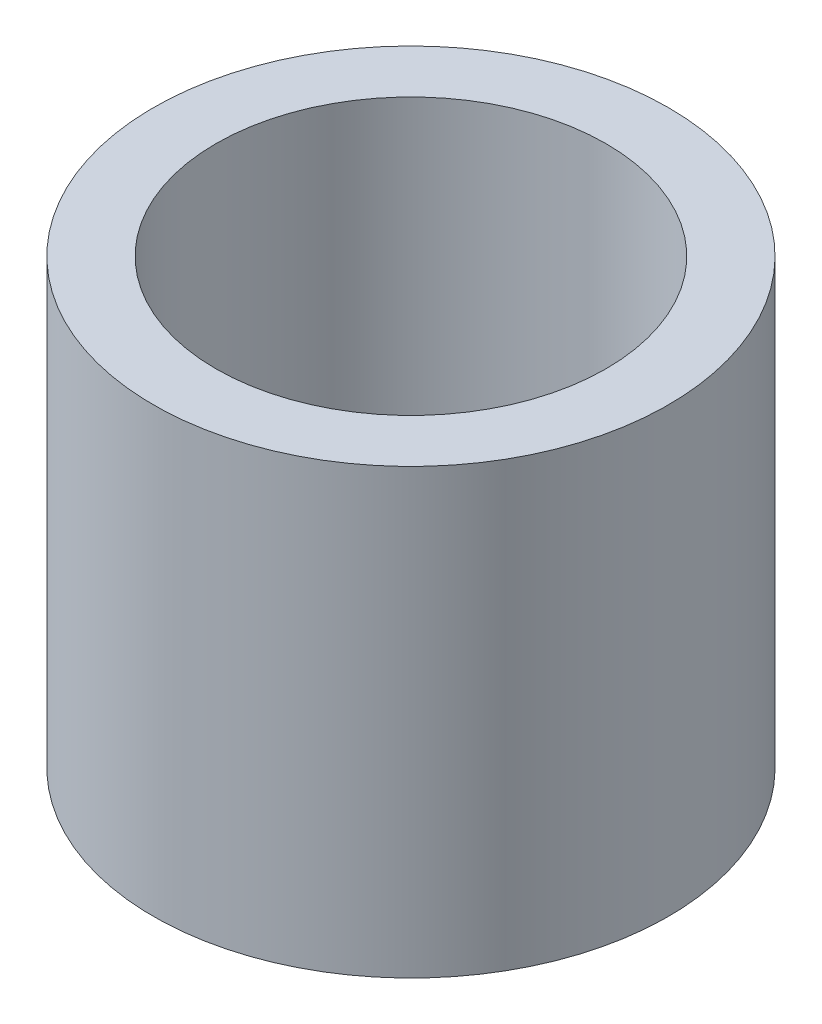
ISO-10303-21;
HEADER;
FILE_DESCRIPTION(('STEP AP214'),'2;1');
FILE_NAME('part.step','',(''),(''),'','','');
FILE_SCHEMA(('AUTOMOTIVE_DESIGN { 1 0 10303 214 1 1 1 1 }'));
ENDSEC;
DATA;
#1=APPLICATION_CONTEXT('core data for automotive mechanical design processes');
#2=APPLICATION_PROTOCOL_DEFINITION('international standard','automotive_design',2000,#1);
#3=PRODUCT_CONTEXT('',#1,'mechanical');
#4=PRODUCT('Part','Part','',(#3));
#5=PRODUCT_RELATED_PRODUCT_CATEGORY('part','',(#4));
#6=PRODUCT_DEFINITION_FORMATION('','',#4);
#7=PRODUCT_DEFINITION_CONTEXT('part definition',#1,'design');
#8=PRODUCT_DEFINITION('design','',#6,#7);
#9=PRODUCT_DEFINITION_SHAPE('','',#8);
#10=(LENGTH_UNIT() NAMED_UNIT(*) SI_UNIT(.MILLI.,.METRE.));
#11=(NAMED_UNIT(*) PLANE_ANGLE_UNIT() SI_UNIT($,.RADIAN.));
#12=(NAMED_UNIT(*) SI_UNIT($,.STERADIAN.) SOLID_ANGLE_UNIT());
#13=UNCERTAINTY_MEASURE_WITH_UNIT(LENGTH_MEASURE(1.E-05),#10,'distance_accuracy_value','');
#14=(GEOMETRIC_REPRESENTATION_CONTEXT(3) GLOBAL_UNCERTAINTY_ASSIGNED_CONTEXT((#13)) GLOBAL_UNIT_ASSIGNED_CONTEXT((#10,
#11,#12)) REPRESENTATION_CONTEXT('',''));
#15=CARTESIAN_POINT('',(0.,0.,0.));
#16=DIRECTION('',(0.,0.,1.));
#17=DIRECTION('',(1.,0.,0.));
#18=AXIS2_PLACEMENT_3D('',#15,#16,#17);
#19=CARTESIAN_POINT('',(-8.25,0.,0.));
#20=DIRECTION('',(0.,1.,0.));
#21=DIRECTION('',(0.,0.,1.));
#22=AXIS2_PLACEMENT_3D('',#19,#20,#21);
#23=PLANE('',#22);
#24=CARTESIAN_POINT('',(0.,0.,0.));
#25=DIRECTION('',(0.,-1.,0.));
#26=DIRECTION('',(0.,0.,-1.));
#27=AXIS2_PLACEMENT_3D('',#24,#25,#26);
#28=CIRCLE('',#27,2.5);
#29=CARTESIAN_POINT('',(0.,0.,-2.5));
#30=VERTEX_POINT('',#29);
#31=EDGE_CURVE('E10',#30,#30,#28,.T.);
#32=ORIENTED_EDGE('',*,*,#31,.F.);
#33=EDGE_LOOP('',(#32));
#34=FACE_BOUND('',#33,.T.);
#35=CARTESIAN_POINT('',(0.,0.,0.));
#36=DIRECTION('',(0.,-1.,0.));
#37=DIRECTION('',(0.,0.,-1.));
#38=AXIS2_PLACEMENT_3D('',#35,#36,#37);
#39=CIRCLE('',#38,8.25);
#40=CARTESIAN_POINT('',(0.,0.,-8.25));
#41=VERTEX_POINT('',#40);
#42=EDGE_CURVE('E53',#41,#41,#39,.T.);
#43=ORIENTED_EDGE('',*,*,#42,.T.);
#44=EDGE_LOOP('',(#43));
#45=FACE_BOUND('',#44,.T.);
#46=ADVANCED_FACE('F31',(#34,#45),#23,.F.);
#47=CARTESIAN_POINT('',(0.,0.,0.));
#48=DIRECTION('',(0.,-1.,0.));
#49=DIRECTION('',(0.,0.,-1.));
#50=AXIS2_PLACEMENT_3D('',#47,#48,#49);
#51=CYLINDRICAL_SURFACE('',#50,2.5);
#52=CARTESIAN_POINT('',(0.,2.,0.));
#53=DIRECTION('',(0.,-1.,0.));
#54=DIRECTION('',(0.,0.,-1.));
#55=AXIS2_PLACEMENT_3D('',#52,#53,#54);
#56=CIRCLE('',#55,2.5);
#57=CARTESIAN_POINT('',(0.,2.,-2.5));
#58=VERTEX_POINT('',#57);
#59=EDGE_CURVE('E37',#58,#58,#56,.T.);
#60=ORIENTED_EDGE('',*,*,#59,.F.);
#61=EDGE_LOOP('',(#60));
#62=FACE_BOUND('',#61,.T.);
#63=ORIENTED_EDGE('',*,*,#31,.T.);
#64=EDGE_LOOP('',(#63));
#65=FACE_BOUND('',#64,.T.);
#66=ADVANCED_FACE('F78',(#62,#65),#51,.F.);
#67=CARTESIAN_POINT('',(-2.5,2.,0.));
#68=DIRECTION('',(0.,-1.,0.));
#69=DIRECTION('',(0.,0.,-1.));
#70=AXIS2_PLACEMENT_3D('',#67,#68,#69);
#71=PLANE('',#70);
#72=CARTESIAN_POINT('',(0.,2.,0.));
#73=DIRECTION('',(0.,-1.,0.));
#74=DIRECTION('',(0.,0.,-1.));
#75=AXIS2_PLACEMENT_3D('',#72,#73,#74);
#76=CIRCLE('',#75,6.25);
#77=CARTESIAN_POINT('',(0.,2.,-6.25));
#78=VERTEX_POINT('',#77);
#79=EDGE_CURVE('E41',#78,#78,#76,.T.);
#80=ORIENTED_EDGE('',*,*,#79,.F.);
#81=EDGE_LOOP('',(#80));
#82=FACE_BOUND('',#81,.T.);
#83=ORIENTED_EDGE('',*,*,#59,.T.);
#84=EDGE_LOOP('',(#83));
#85=FACE_BOUND('',#84,.T.);
#86=ADVANCED_FACE('F73',(#82,#85),#71,.F.);
#87=CARTESIAN_POINT('',(0.,0.,0.));
#88=DIRECTION('',(0.,-1.,0.));
#89=DIRECTION('',(0.,0.,-1.));
#90=AXIS2_PLACEMENT_3D('',#87,#88,#89);
#91=CYLINDRICAL_SURFACE('',#90,6.25);
#92=CARTESIAN_POINT('',(0.,14.1974735986496,0.));
#93=DIRECTION('',(0.,-1.,0.));
#94=DIRECTION('',(0.,0.,-1.));
#95=AXIS2_PLACEMENT_3D('',#92,#93,#94);
#96=CIRCLE('',#95,6.25);
#97=CARTESIAN_POINT('',(0.,14.1974735986496,-6.25));
#98=VERTEX_POINT('',#97);
#99=EDGE_CURVE('E45',#98,#98,#96,.T.);
#100=ORIENTED_EDGE('',*,*,#99,.F.);
#101=EDGE_LOOP('',(#100));
#102=FACE_BOUND('',#101,.T.);
#103=ORIENTED_EDGE('',*,*,#79,.T.);
#104=EDGE_LOOP('',(#103));
#105=FACE_BOUND('',#104,.T.);
#106=ADVANCED_FACE('F67',(#102,#105),#91,.F.);
#107=CARTESIAN_POINT('',(-6.25,14.1974735986496,0.));
#108=DIRECTION('',(0.,-1.,0.));
#109=DIRECTION('',(0.,0.,-1.));
#110=AXIS2_PLACEMENT_3D('',#107,#108,#109);
#111=PLANE('',#110);
#112=CARTESIAN_POINT('',(0.,14.1974735986496,0.));
#113=DIRECTION('',(0.,-1.,0.));
#114=DIRECTION('',(0.,0.,-1.));
#115=AXIS2_PLACEMENT_3D('',#112,#113,#114);
#116=CIRCLE('',#115,8.25);
#117=CARTESIAN_POINT('',(0.,14.1974735986496,-8.25));
#118=VERTEX_POINT('',#117);
#119=EDGE_CURVE('E50',#118,#118,#116,.T.);
#120=ORIENTED_EDGE('',*,*,#119,.F.);
#121=EDGE_LOOP('',(#120));
#122=FACE_BOUND('',#121,.T.);
#123=ORIENTED_EDGE('',*,*,#99,.T.);
#124=EDGE_LOOP('',(#123));
#125=FACE_BOUND('',#124,.T.);
#126=ADVANCED_FACE('F61',(#122,#125),#111,.F.);
#127=CARTESIAN_POINT('',(0.,0.,0.));
#128=DIRECTION('',(0.,-1.,0.));
#129=DIRECTION('',(0.,0.,-1.));
#130=AXIS2_PLACEMENT_3D('',#127,#128,#129);
#131=CYLINDRICAL_SURFACE('',#130,8.25);
#132=ORIENTED_EDGE('',*,*,#42,.F.);
#133=EDGE_LOOP('',(#132));
#134=FACE_BOUND('',#133,.T.);
#135=ORIENTED_EDGE('',*,*,#119,.T.);
#136=EDGE_LOOP('',(#135));
#137=FACE_BOUND('',#136,.T.);
#138=ADVANCED_FACE('F58',(#134,#137),#131,.T.);
#139=CLOSED_SHELL('',(#46,#66,#86,#106,#126,#138));
#140=MANIFOLD_SOLID_BREP('B2',#139);
#141=ADVANCED_BREP_SHAPE_REPRESENTATION('',(#18,#140),#14);
#142=SHAPE_DEFINITION_REPRESENTATION(#9,#141);
ENDSEC;
END-ISO-10303-21;
